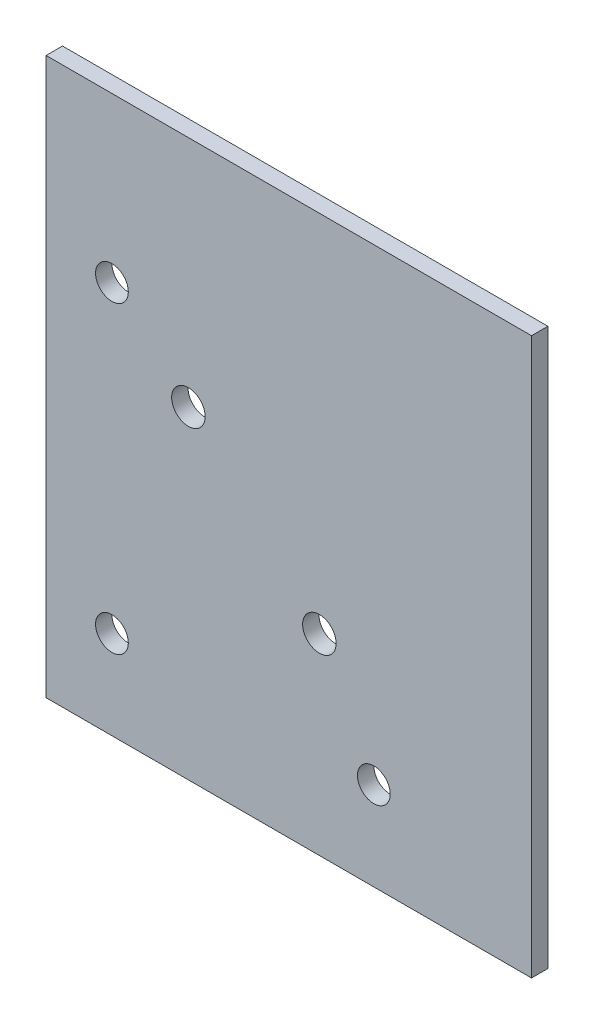
ISO-10303-21;
HEADER;
FILE_DESCRIPTION(('STEP AP214'),'2;1');
FILE_NAME('part.step','',(''),(''),'','','');
FILE_SCHEMA(('AUTOMOTIVE_DESIGN { 1 0 10303 214 1 1 1 1 }'));
ENDSEC;
DATA;
#1=APPLICATION_CONTEXT('core data for automotive mechanical design processes');
#2=APPLICATION_PROTOCOL_DEFINITION('international standard','automotive_design',2000,#1);
#3=PRODUCT_CONTEXT('',#1,'mechanical');
#4=PRODUCT('Part','Part','',(#3));
#5=PRODUCT_RELATED_PRODUCT_CATEGORY('part','',(#4));
#6=PRODUCT_DEFINITION_FORMATION('','',#4);
#7=PRODUCT_DEFINITION_CONTEXT('part definition',#1,'design');
#8=PRODUCT_DEFINITION('design','',#6,#7);
#9=PRODUCT_DEFINITION_SHAPE('','',#8);
#10=(LENGTH_UNIT() NAMED_UNIT(*) SI_UNIT(.MILLI.,.METRE.));
#11=(NAMED_UNIT(*) PLANE_ANGLE_UNIT() SI_UNIT($,.RADIAN.));
#12=(NAMED_UNIT(*) SI_UNIT($,.STERADIAN.) SOLID_ANGLE_UNIT());
#13=UNCERTAINTY_MEASURE_WITH_UNIT(LENGTH_MEASURE(1.E-05),#10,'distance_accuracy_value','');
#14=(GEOMETRIC_REPRESENTATION_CONTEXT(3) GLOBAL_UNCERTAINTY_ASSIGNED_CONTEXT((#13)) GLOBAL_UNIT_ASSIGNED_CONTEXT((#10,
#11,#12)) REPRESENTATION_CONTEXT('',''));
#15=CARTESIAN_POINT('',(0.,0.,0.));
#16=DIRECTION('',(0.,0.,1.));
#17=DIRECTION('',(1.,0.,0.));
#18=AXIS2_PLACEMENT_3D('',#15,#16,#17);
#19=CARTESIAN_POINT('',(0.,0.,3.175));
#20=DIRECTION('',(0.,0.,1.));
#21=DIRECTION('',(1.,0.,0.));
#22=AXIS2_PLACEMENT_3D('',#19,#20,#21);
#23=PLANE('',#22);
#24=CARTESIAN_POINT('',(-61.3674606904029,163.396667497816,3.175));
#25=DIRECTION('',(0.,0.,1.));
#26=DIRECTION('',(1.,0.,0.));
#27=AXIS2_PLACEMENT_3D('',#24,#25,#26);
#28=CIRCLE('',#27,3.25119999999999);
#29=CARTESIAN_POINT('',(-58.1162606904029,163.396667497816,3.175));
#30=VERTEX_POINT('',#29);
#31=EDGE_CURVE('E156',#30,#30,#28,.T.);
#32=ORIENTED_EDGE('',*,*,#31,.F.);
#33=EDGE_LOOP('',(#32));
#34=FACE_BOUND('',#33,.T.);
#35=CARTESIAN_POINT('',(-25.4000000000004,117.928571428571,3.175));
#36=DIRECTION('',(0.,0.,1.));
#37=DIRECTION('',(1.,0.,0.));
#38=AXIS2_PLACEMENT_3D('',#35,#36,#37);
#39=CIRCLE('',#38,3.175);
#40=CARTESIAN_POINT('',(-22.2250000000004,117.928571428571,3.175));
#41=VERTEX_POINT('',#40);
#42=EDGE_CURVE('E140',#41,#41,#39,.T.);
#43=ORIENTED_EDGE('',*,*,#42,.F.);
#44=EDGE_LOOP('',(#43));
#45=FACE_BOUND('',#44,.T.);
#46=DIRECTION('',(0.,1.,0.));
#47=VECTOR('',#46,1.);
#48=CARTESIAN_POINT('',(5.18327110159333,100.76040929178,3.175));
#49=LINE('',#48,#47);
#50=CARTESIAN_POINT('',(5.18327110159333,100.76040929178,3.175));
#51=VERTEX_POINT('',#50);
#52=CARTESIAN_POINT('',(5.18327110159333,208.650287830947,3.175));
#53=VERTEX_POINT('',#52);
#54=EDGE_CURVE('E98',#51,#53,#49,.T.);
#55=ORIENTED_EDGE('',*,*,#54,.T.);
#56=DIRECTION('',(-1.,0.,0.));
#57=VECTOR('',#56,1.);
#58=CARTESIAN_POINT('',(5.18327110159333,208.650287830947,3.175));
#59=LINE('',#58,#57);
#60=CARTESIAN_POINT('',(-88.9666501122157,208.650287830947,3.175));
#61=VERTEX_POINT('',#60);
#62=EDGE_CURVE('E93',#53,#61,#59,.T.);
#63=ORIENTED_EDGE('',*,*,#62,.T.);
#64=DIRECTION('',(0.,-1.,0.));
#65=VECTOR('',#64,1.);
#66=CARTESIAN_POINT('',(-88.9666501122157,100.76040929178,3.175));
#67=LINE('',#66,#65);
#68=CARTESIAN_POINT('',(-88.9666501122157,100.76040929178,3.175));
#69=VERTEX_POINT('',#68);
#70=EDGE_CURVE('E96',#61,#69,#67,.T.);
#71=ORIENTED_EDGE('',*,*,#70,.T.);
#72=DIRECTION('',(1.,0.,0.));
#73=VECTOR('',#72,1.);
#74=CARTESIAN_POINT('',(5.18327110159333,100.76040929178,3.175));
#75=LINE('',#74,#73);
#76=EDGE_CURVE('E63',#69,#51,#75,.T.);
#77=ORIENTED_EDGE('',*,*,#76,.T.);
#78=EDGE_LOOP('',(#55,#63,#71,#77));
#79=FACE_BOUND('',#78,.T.);
#80=CARTESIAN_POINT('',(-76.2000000000004,117.928571428571,3.175));
#81=DIRECTION('',(0.,0.,1.));
#82=DIRECTION('',(1.,0.,0.));
#83=AXIS2_PLACEMENT_3D('',#80,#81,#82);
#84=CIRCLE('',#83,3.175);
#85=CARTESIAN_POINT('',(-73.0250000000004,117.928571428571,3.175));
#86=VERTEX_POINT('',#85);
#87=EDGE_CURVE('E118',#86,#86,#84,.T.);
#88=ORIENTED_EDGE('',*,*,#87,.F.);
#89=EDGE_LOOP('',(#88));
#90=FACE_BOUND('',#89,.T.);
#91=CARTESIAN_POINT('',(-76.2000000000006,176.892857142857,3.175));
#92=DIRECTION('',(0.,0.,1.));
#93=DIRECTION('',(1.,0.,0.));
#94=AXIS2_PLACEMENT_3D('',#91,#92,#93);
#95=CIRCLE('',#94,3.17499999999998);
#96=CARTESIAN_POINT('',(-73.0250000000006,176.892857142857,3.175));
#97=VERTEX_POINT('',#96);
#98=EDGE_CURVE('E148',#97,#97,#95,.T.);
#99=ORIENTED_EDGE('',*,*,#98,.F.);
#100=EDGE_LOOP('',(#99));
#101=FACE_BOUND('',#100,.T.);
#102=CARTESIAN_POINT('',(-35.9674606904029,137.996667497816,3.175));
#103=DIRECTION('',(0.,0.,1.));
#104=DIRECTION('',(1.,0.,0.));
#105=AXIS2_PLACEMENT_3D('',#102,#103,#104);
#106=CIRCLE('',#105,3.25119999999999);
#107=CARTESIAN_POINT('',(-32.7162606904029,137.996667497816,3.175));
#108=VERTEX_POINT('',#107);
#109=EDGE_CURVE('E164',#108,#108,#106,.T.);
#110=ORIENTED_EDGE('',*,*,#109,.F.);
#111=EDGE_LOOP('',(#110));
#112=FACE_BOUND('',#111,.T.);
#113=ADVANCED_FACE('F45',(#34,#45,#79,#90,#101,#112),#23,.T.);
#114=CARTESIAN_POINT('',(0.,0.,0.));
#115=DIRECTION('',(0.,0.,1.));
#116=DIRECTION('',(1.,0.,0.));
#117=AXIS2_PLACEMENT_3D('',#114,#115,#116);
#118=PLANE('',#117);
#119=DIRECTION('',(0.,1.,0.));
#120=VECTOR('',#119,1.);
#121=CARTESIAN_POINT('',(5.18327110159333,100.76040929178,0.));
#122=LINE('',#121,#120);
#123=CARTESIAN_POINT('',(5.18327110159333,100.76040929178,0.));
#124=VERTEX_POINT('',#123);
#125=CARTESIAN_POINT('',(5.18327110159333,208.650287830947,0.));
#126=VERTEX_POINT('',#125);
#127=EDGE_CURVE('E114',#124,#126,#122,.T.);
#128=ORIENTED_EDGE('',*,*,#127,.F.);
#129=DIRECTION('',(1.,0.,0.));
#130=VECTOR('',#129,1.);
#131=CARTESIAN_POINT('',(5.18327110159333,100.76040929178,0.));
#132=LINE('',#131,#130);
#133=CARTESIAN_POINT('',(-88.9666501122157,100.76040929178,0.));
#134=VERTEX_POINT('',#133);
#135=EDGE_CURVE('E86',#134,#124,#132,.T.);
#136=ORIENTED_EDGE('',*,*,#135,.F.);
#137=DIRECTION('',(0.,-1.,0.));
#138=VECTOR('',#137,1.);
#139=CARTESIAN_POINT('',(-88.9666501122157,100.76040929178,0.));
#140=LINE('',#139,#138);
#141=CARTESIAN_POINT('',(-88.9666501122157,208.650287830947,0.));
#142=VERTEX_POINT('',#141);
#143=EDGE_CURVE('E80',#142,#134,#140,.T.);
#144=ORIENTED_EDGE('',*,*,#143,.F.);
#145=DIRECTION('',(-1.,0.,0.));
#146=VECTOR('',#145,1.);
#147=CARTESIAN_POINT('',(5.18327110159333,208.650287830947,0.));
#148=LINE('',#147,#146);
#149=EDGE_CURVE('E103',#126,#142,#148,.T.);
#150=ORIENTED_EDGE('',*,*,#149,.F.);
#151=EDGE_LOOP('',(#128,#136,#144,#150));
#152=FACE_BOUND('',#151,.T.);
#153=CARTESIAN_POINT('',(-76.2000000000004,117.928571428571,0.));
#154=DIRECTION('',(0.,0.,1.));
#155=DIRECTION('',(1.,0.,0.));
#156=AXIS2_PLACEMENT_3D('',#153,#154,#155);
#157=CIRCLE('',#156,3.175);
#158=CARTESIAN_POINT('',(-73.0250000000004,117.928571428571,0.));
#159=VERTEX_POINT('',#158);
#160=EDGE_CURVE('E136',#159,#159,#157,.T.);
#161=ORIENTED_EDGE('',*,*,#160,.T.);
#162=EDGE_LOOP('',(#161));
#163=FACE_BOUND('',#162,.T.);
#164=CARTESIAN_POINT('',(-25.4000000000004,117.928571428571,0.));
#165=DIRECTION('',(0.,0.,1.));
#166=DIRECTION('',(1.,0.,0.));
#167=AXIS2_PLACEMENT_3D('',#164,#165,#166);
#168=CIRCLE('',#167,3.175);
#169=CARTESIAN_POINT('',(-22.2250000000004,117.928571428571,0.));
#170=VERTEX_POINT('',#169);
#171=EDGE_CURVE('E144',#170,#170,#168,.T.);
#172=ORIENTED_EDGE('',*,*,#171,.T.);
#173=EDGE_LOOP('',(#172));
#174=FACE_BOUND('',#173,.T.);
#175=CARTESIAN_POINT('',(-76.2000000000006,176.892857142857,0.));
#176=DIRECTION('',(0.,0.,1.));
#177=DIRECTION('',(1.,0.,0.));
#178=AXIS2_PLACEMENT_3D('',#175,#176,#177);
#179=CIRCLE('',#178,3.17499999999998);
#180=CARTESIAN_POINT('',(-73.0250000000006,176.892857142857,0.));
#181=VERTEX_POINT('',#180);
#182=EDGE_CURVE('E152',#181,#181,#179,.T.);
#183=ORIENTED_EDGE('',*,*,#182,.T.);
#184=EDGE_LOOP('',(#183));
#185=FACE_BOUND('',#184,.T.);
#186=CARTESIAN_POINT('',(-61.3674606904029,163.396667497816,0.));
#187=DIRECTION('',(0.,0.,1.));
#188=DIRECTION('',(1.,0.,0.));
#189=AXIS2_PLACEMENT_3D('',#186,#187,#188);
#190=CIRCLE('',#189,3.25119999999999);
#191=CARTESIAN_POINT('',(-58.1162606904029,163.396667497816,0.));
#192=VERTEX_POINT('',#191);
#193=EDGE_CURVE('E160',#192,#192,#190,.T.);
#194=ORIENTED_EDGE('',*,*,#193,.T.);
#195=EDGE_LOOP('',(#194));
#196=FACE_BOUND('',#195,.T.);
#197=CARTESIAN_POINT('',(-35.9674606904029,137.996667497816,0.));
#198=DIRECTION('',(0.,0.,1.));
#199=DIRECTION('',(1.,0.,0.));
#200=AXIS2_PLACEMENT_3D('',#197,#198,#199);
#201=CIRCLE('',#200,3.25119999999999);
#202=CARTESIAN_POINT('',(-32.7162606904029,137.996667497816,0.));
#203=VERTEX_POINT('',#202);
#204=EDGE_CURVE('E168',#203,#203,#201,.T.);
#205=ORIENTED_EDGE('',*,*,#204,.T.);
#206=EDGE_LOOP('',(#205));
#207=FACE_BOUND('',#206,.T.);
#208=ADVANCED_FACE('F131',(#152,#163,#174,#185,#196,#207),#118,.F.);
#209=CARTESIAN_POINT('',(5.18327110159333,100.76040929178,3.175));
#210=DIRECTION('',(-1.,0.,0.));
#211=DIRECTION('',(0.,0.,1.));
#212=AXIS2_PLACEMENT_3D('',#209,#210,#211);
#213=PLANE('',#212);
#214=ORIENTED_EDGE('',*,*,#127,.T.);
#215=DIRECTION('',(0.,0.,-1.));
#216=VECTOR('',#215,1.);
#217=CARTESIAN_POINT('',(5.18327110159333,208.650287830947,3.175));
#218=LINE('',#217,#216);
#219=EDGE_CURVE('E11',#53,#126,#218,.T.);
#220=ORIENTED_EDGE('',*,*,#219,.F.);
#221=ORIENTED_EDGE('',*,*,#54,.F.);
#222=DIRECTION('',(0.,0.,-1.));
#223=VECTOR('',#222,1.);
#224=CARTESIAN_POINT('',(5.18327110159333,100.76040929178,3.175));
#225=LINE('',#224,#223);
#226=EDGE_CURVE('E110',#51,#124,#225,.T.);
#227=ORIENTED_EDGE('',*,*,#226,.T.);
#228=EDGE_LOOP('',(#214,#220,#221,#227));
#229=FACE_BOUND('',#228,.T.);
#230=ADVANCED_FACE('F47',(#229),#213,.F.);
#231=CARTESIAN_POINT('',(5.18327110159333,208.650287830947,3.175));
#232=DIRECTION('',(0.,-1.,0.));
#233=DIRECTION('',(0.,0.,-1.));
#234=AXIS2_PLACEMENT_3D('',#231,#232,#233);
#235=PLANE('',#234);
#236=ORIENTED_EDGE('',*,*,#149,.T.);
#237=DIRECTION('',(0.,0.,-1.));
#238=VECTOR('',#237,1.);
#239=CARTESIAN_POINT('',(-88.9666501122157,208.650287830947,3.175));
#240=LINE('',#239,#238);
#241=EDGE_CURVE('E55',#61,#142,#240,.T.);
#242=ORIENTED_EDGE('',*,*,#241,.F.);
#243=ORIENTED_EDGE('',*,*,#62,.F.);
#244=ORIENTED_EDGE('',*,*,#219,.T.);
#245=EDGE_LOOP('',(#236,#242,#243,#244));
#246=FACE_BOUND('',#245,.T.);
#247=ADVANCED_FACE('F102',(#246),#235,.F.);
#248=CARTESIAN_POINT('',(-88.9666501122157,100.76040929178,3.175));
#249=DIRECTION('',(1.,0.,0.));
#250=DIRECTION('',(0.,0.,-1.));
#251=AXIS2_PLACEMENT_3D('',#248,#249,#250);
#252=PLANE('',#251);
#253=ORIENTED_EDGE('',*,*,#143,.T.);
#254=DIRECTION('',(0.,0.,-1.));
#255=VECTOR('',#254,1.);
#256=CARTESIAN_POINT('',(-88.9666501122157,100.76040929178,3.175));
#257=LINE('',#256,#255);
#258=EDGE_CURVE('E105',#69,#134,#257,.T.);
#259=ORIENTED_EDGE('',*,*,#258,.F.);
#260=ORIENTED_EDGE('',*,*,#70,.F.);
#261=ORIENTED_EDGE('',*,*,#241,.T.);
#262=EDGE_LOOP('',(#253,#259,#260,#261));
#263=FACE_BOUND('',#262,.T.);
#264=ADVANCED_FACE('F106',(#263),#252,.F.);
#265=CARTESIAN_POINT('',(5.18327110159333,100.76040929178,3.175));
#266=DIRECTION('',(0.,1.,0.));
#267=DIRECTION('',(-1.,0.,0.));
#268=AXIS2_PLACEMENT_3D('',#265,#266,#267);
#269=PLANE('',#268);
#270=ORIENTED_EDGE('',*,*,#135,.T.);
#271=ORIENTED_EDGE('',*,*,#226,.F.);
#272=ORIENTED_EDGE('',*,*,#76,.F.);
#273=ORIENTED_EDGE('',*,*,#258,.T.);
#274=EDGE_LOOP('',(#270,#271,#272,#273));
#275=FACE_BOUND('',#274,.T.);
#276=ADVANCED_FACE('F128',(#275),#269,.F.);
#277=CARTESIAN_POINT('',(-76.2000000000004,117.928571428571,3.175));
#278=DIRECTION('',(0.,0.,-1.));
#279=DIRECTION('',(-1.,0.,0.));
#280=AXIS2_PLACEMENT_3D('',#277,#278,#279);
#281=CYLINDRICAL_SURFACE('',#280,3.175);
#282=ORIENTED_EDGE('',*,*,#87,.T.);
#283=EDGE_LOOP('',(#282));
#284=FACE_BOUND('',#283,.T.);
#285=ORIENTED_EDGE('',*,*,#160,.F.);
#286=EDGE_LOOP('',(#285));
#287=FACE_BOUND('',#286,.T.);
#288=ADVANCED_FACE('F189',(#284,#287),#281,.F.);
#289=CARTESIAN_POINT('',(-25.4000000000004,117.928571428571,3.175));
#290=DIRECTION('',(0.,0.,-1.));
#291=DIRECTION('',(-1.,0.,0.));
#292=AXIS2_PLACEMENT_3D('',#289,#290,#291);
#293=CYLINDRICAL_SURFACE('',#292,3.175);
#294=ORIENTED_EDGE('',*,*,#42,.T.);
#295=EDGE_LOOP('',(#294));
#296=FACE_BOUND('',#295,.T.);
#297=ORIENTED_EDGE('',*,*,#171,.F.);
#298=EDGE_LOOP('',(#297));
#299=FACE_BOUND('',#298,.T.);
#300=ADVANCED_FACE('F257',(#296,#299),#293,.F.);
#301=CARTESIAN_POINT('',(-76.2000000000006,176.892857142857,3.175));
#302=DIRECTION('',(0.,0.,-1.));
#303=DIRECTION('',(-1.,0.,0.));
#304=AXIS2_PLACEMENT_3D('',#301,#302,#303);
#305=CYLINDRICAL_SURFACE('',#304,3.17499999999998);
#306=ORIENTED_EDGE('',*,*,#98,.T.);
#307=EDGE_LOOP('',(#306));
#308=FACE_BOUND('',#307,.T.);
#309=ORIENTED_EDGE('',*,*,#182,.F.);
#310=EDGE_LOOP('',(#309));
#311=FACE_BOUND('',#310,.T.);
#312=ADVANCED_FACE('F268',(#308,#311),#305,.F.);
#313=CARTESIAN_POINT('',(-61.3674606904029,163.396667497816,3.175));
#314=DIRECTION('',(0.,0.,-1.));
#315=DIRECTION('',(-1.,0.,0.));
#316=AXIS2_PLACEMENT_3D('',#313,#314,#315);
#317=CYLINDRICAL_SURFACE('',#316,3.25119999999999);
#318=ORIENTED_EDGE('',*,*,#31,.T.);
#319=EDGE_LOOP('',(#318));
#320=FACE_BOUND('',#319,.T.);
#321=ORIENTED_EDGE('',*,*,#193,.F.);
#322=EDGE_LOOP('',(#321));
#323=FACE_BOUND('',#322,.T.);
#324=ADVANCED_FACE('F279',(#320,#323),#317,.F.);
#325=CARTESIAN_POINT('',(-35.9674606904029,137.996667497816,3.175));
#326=DIRECTION('',(0.,0.,-1.));
#327=DIRECTION('',(-1.,0.,0.));
#328=AXIS2_PLACEMENT_3D('',#325,#326,#327);
#329=CYLINDRICAL_SURFACE('',#328,3.25119999999999);
#330=ORIENTED_EDGE('',*,*,#109,.T.);
#331=EDGE_LOOP('',(#330));
#332=FACE_BOUND('',#331,.T.);
#333=ORIENTED_EDGE('',*,*,#204,.F.);
#334=EDGE_LOOP('',(#333));
#335=FACE_BOUND('',#334,.T.);
#336=ADVANCED_FACE('F176',(#332,#335),#329,.F.);
#337=CLOSED_SHELL('',(#113,#208,#230,#247,#264,#276,#288,#300,#312,#324,#336));
#338=MANIFOLD_SOLID_BREP('B2',#337);
#339=ADVANCED_BREP_SHAPE_REPRESENTATION('',(#18,#338),#14);
#340=SHAPE_DEFINITION_REPRESENTATION(#9,#339);
ENDSEC;
END-ISO-10303-21;
